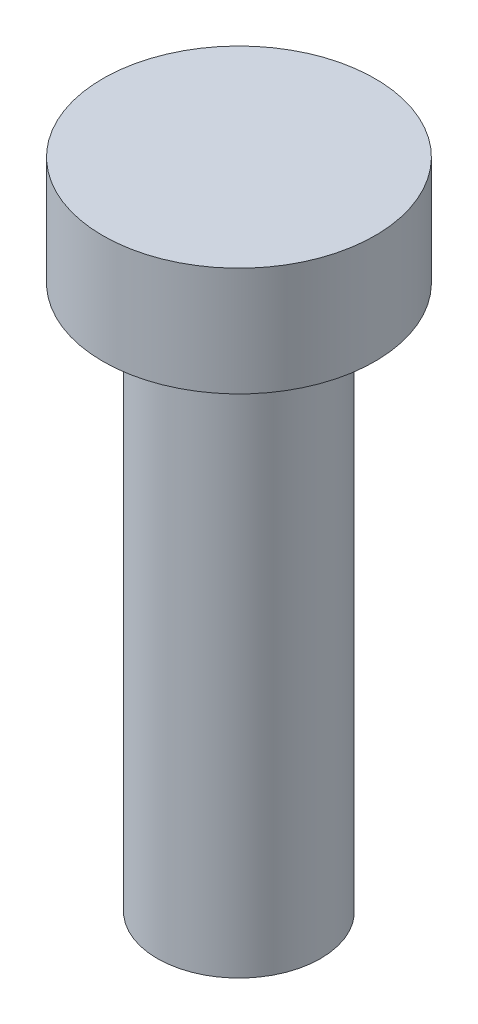
ISO-10303-21;
HEADER;
FILE_DESCRIPTION(('STEP AP214'),'2;1');
FILE_NAME('part.step','',(''),(''),'','','');
FILE_SCHEMA(('AUTOMOTIVE_DESIGN { 1 0 10303 214 1 1 1 1 }'));
ENDSEC;
DATA;
#1=APPLICATION_CONTEXT('core data for automotive mechanical design processes');
#2=APPLICATION_PROTOCOL_DEFINITION('international standard','automotive_design',2000,#1);
#3=PRODUCT_CONTEXT('',#1,'mechanical');
#4=PRODUCT('Part','Part','',(#3));
#5=PRODUCT_RELATED_PRODUCT_CATEGORY('part','',(#4));
#6=PRODUCT_DEFINITION_FORMATION('','',#4);
#7=PRODUCT_DEFINITION_CONTEXT('part definition',#1,'design');
#8=PRODUCT_DEFINITION('design','',#6,#7);
#9=PRODUCT_DEFINITION_SHAPE('','',#8);
#10=(LENGTH_UNIT() NAMED_UNIT(*) SI_UNIT(.MILLI.,.METRE.));
#11=(NAMED_UNIT(*) PLANE_ANGLE_UNIT() SI_UNIT($,.RADIAN.));
#12=(NAMED_UNIT(*) SI_UNIT($,.STERADIAN.) SOLID_ANGLE_UNIT());
#13=UNCERTAINTY_MEASURE_WITH_UNIT(LENGTH_MEASURE(1.E-05),#10,'distance_accuracy_value','');
#14=(GEOMETRIC_REPRESENTATION_CONTEXT(3) GLOBAL_UNCERTAINTY_ASSIGNED_CONTEXT((#13)) GLOBAL_UNIT_ASSIGNED_CONTEXT((#10,
#11,#12)) REPRESENTATION_CONTEXT('',''));
#15=CARTESIAN_POINT('',(0.,0.,0.));
#16=DIRECTION('',(0.,0.,1.));
#17=DIRECTION('',(1.,0.,0.));
#18=AXIS2_PLACEMENT_3D('',#15,#16,#17);
#19=CARTESIAN_POINT('',(0.,10.,0.));
#20=DIRECTION('',(0.,-1.,0.));
#21=DIRECTION('',(0.,0.,-1.));
#22=AXIS2_PLACEMENT_3D('',#19,#20,#21);
#23=CYLINDRICAL_SURFACE('',#22,1.5);
#24=CARTESIAN_POINT('',(0.,10.,0.));
#25=DIRECTION('',(0.,1.,0.));
#26=DIRECTION('',(0.,0.,1.));
#27=AXIS2_PLACEMENT_3D('',#24,#25,#26);
#28=CIRCLE('',#27,1.5);
#29=CARTESIAN_POINT('',(0.,10.,1.5));
#30=VERTEX_POINT('',#29);
#31=EDGE_CURVE('E10',#30,#30,#28,.T.);
#32=ORIENTED_EDGE('',*,*,#31,.F.);
#33=EDGE_LOOP('',(#32));
#34=FACE_BOUND('',#33,.T.);
#35=CARTESIAN_POINT('',(0.,0.,0.));
#36=DIRECTION('',(0.,1.,0.));
#37=DIRECTION('',(0.,0.,1.));
#38=AXIS2_PLACEMENT_3D('',#35,#36,#37);
#39=CIRCLE('',#38,1.5);
#40=CARTESIAN_POINT('',(0.,0.,1.5));
#41=VERTEX_POINT('',#40);
#42=EDGE_CURVE('E33',#41,#41,#39,.T.);
#43=ORIENTED_EDGE('',*,*,#42,.T.);
#44=EDGE_LOOP('',(#43));
#45=FACE_BOUND('',#44,.T.);
#46=ADVANCED_FACE('F30',(#34,#45),#23,.T.);
#47=CARTESIAN_POINT('',(0.,0.,0.));
#48=DIRECTION('',(0.,1.,0.));
#49=DIRECTION('',(0.,0.,1.));
#50=AXIS2_PLACEMENT_3D('',#47,#48,#49);
#51=PLANE('',#50);
#52=ORIENTED_EDGE('',*,*,#42,.F.);
#53=EDGE_LOOP('',(#52));
#54=FACE_BOUND('',#53,.T.);
#55=ADVANCED_FACE('F58',(#54),#51,.F.);
#56=CARTESIAN_POINT('',(0.,10.,0.));
#57=DIRECTION('',(0.,1.,0.));
#58=DIRECTION('',(0.,0.,1.));
#59=AXIS2_PLACEMENT_3D('',#56,#57,#58);
#60=PLANE('',#59);
#61=CARTESIAN_POINT('',(0.,10.,0.));
#62=DIRECTION('',(0.,1.,0.));
#63=DIRECTION('',(0.,0.,1.));
#64=AXIS2_PLACEMENT_3D('',#61,#62,#63);
#65=CIRCLE('',#64,2.5);
#66=CARTESIAN_POINT('',(0.,10.,2.5));
#67=VERTEX_POINT('',#66);
#68=EDGE_CURVE('E42',#67,#67,#65,.T.);
#69=ORIENTED_EDGE('',*,*,#68,.F.);
#70=EDGE_LOOP('',(#69));
#71=FACE_BOUND('',#70,.T.);
#72=ORIENTED_EDGE('',*,*,#31,.T.);
#73=EDGE_LOOP('',(#72));
#74=FACE_BOUND('',#73,.T.);
#75=ADVANCED_FACE('F53',(#71,#74),#60,.F.);
#76=CARTESIAN_POINT('',(0.,12.,0.));
#77=DIRECTION('',(0.,-1.,0.));
#78=DIRECTION('',(0.,0.,-1.));
#79=AXIS2_PLACEMENT_3D('',#76,#77,#78);
#80=CYLINDRICAL_SURFACE('',#79,2.5);
#81=CARTESIAN_POINT('',(0.,12.,0.));
#82=DIRECTION('',(0.,1.,0.));
#83=DIRECTION('',(0.,0.,1.));
#84=AXIS2_PLACEMENT_3D('',#81,#82,#83);
#85=CIRCLE('',#84,2.5);
#86=CARTESIAN_POINT('',(0.,12.,2.5));
#87=VERTEX_POINT('',#86);
#88=EDGE_CURVE('E40',#87,#87,#85,.T.);
#89=ORIENTED_EDGE('',*,*,#88,.F.);
#90=EDGE_LOOP('',(#89));
#91=FACE_BOUND('',#90,.T.);
#92=ORIENTED_EDGE('',*,*,#68,.T.);
#93=EDGE_LOOP('',(#92));
#94=FACE_BOUND('',#93,.T.);
#95=ADVANCED_FACE('F50',(#91,#94),#80,.T.);
#96=CARTESIAN_POINT('',(0.,12.,0.));
#97=DIRECTION('',(0.,1.,0.));
#98=DIRECTION('',(0.,0.,1.));
#99=AXIS2_PLACEMENT_3D('',#96,#97,#98);
#100=PLANE('',#99);
#101=ORIENTED_EDGE('',*,*,#88,.T.);
#102=EDGE_LOOP('',(#101));
#103=FACE_BOUND('',#102,.T.);
#104=ADVANCED_FACE('F48',(#103),#100,.T.);
#105=CLOSED_SHELL('',(#46,#55,#75,#95,#104));
#106=MANIFOLD_SOLID_BREP('B2',#105);
#107=ADVANCED_BREP_SHAPE_REPRESENTATION('',(#18,#106),#14);
#108=SHAPE_DEFINITION_REPRESENTATION(#9,#107);
ENDSEC;
END-ISO-10303-21;
